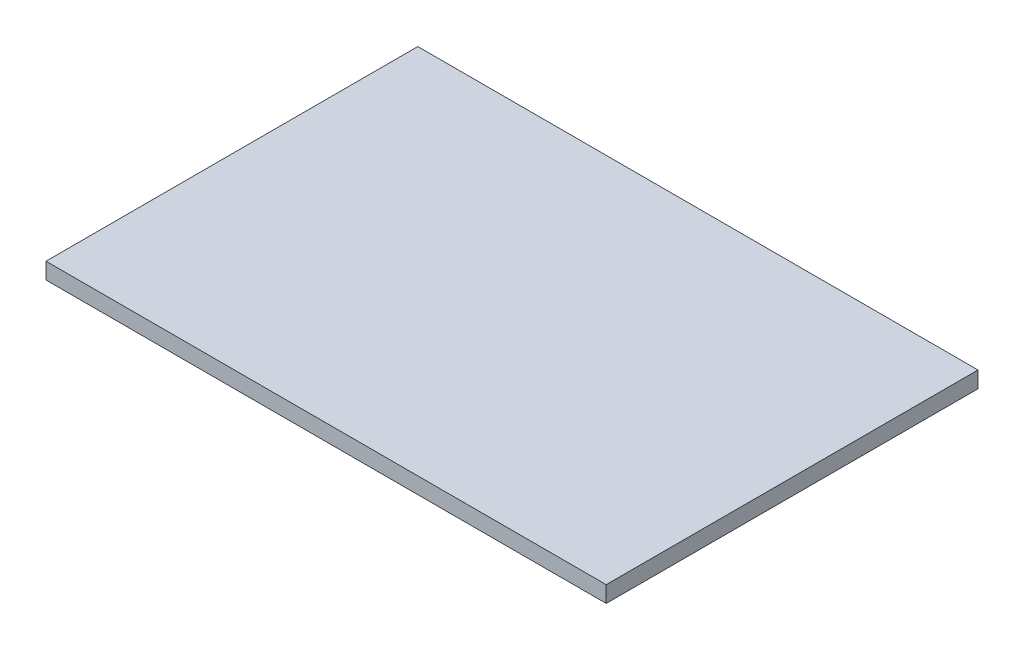
ISO-10303-21;
HEADER;
FILE_DESCRIPTION(('STEP AP214'),'2;1');
FILE_NAME('part.step','',(''),(''),'','','');
FILE_SCHEMA(('AUTOMOTIVE_DESIGN { 1 0 10303 214 1 1 1 1 }'));
ENDSEC;
DATA;
#1=APPLICATION_CONTEXT('core data for automotive mechanical design processes');
#2=APPLICATION_PROTOCOL_DEFINITION('international standard','automotive_design',2000,#1);
#3=PRODUCT_CONTEXT('',#1,'mechanical');
#4=PRODUCT('Part','Part','',(#3));
#5=PRODUCT_RELATED_PRODUCT_CATEGORY('part','',(#4));
#6=PRODUCT_DEFINITION_FORMATION('','',#4);
#7=PRODUCT_DEFINITION_CONTEXT('part definition',#1,'design');
#8=PRODUCT_DEFINITION('design','',#6,#7);
#9=PRODUCT_DEFINITION_SHAPE('','',#8);
#10=(LENGTH_UNIT() NAMED_UNIT(*) SI_UNIT(.MILLI.,.METRE.));
#11=(NAMED_UNIT(*) PLANE_ANGLE_UNIT() SI_UNIT($,.RADIAN.));
#12=(NAMED_UNIT(*) SI_UNIT($,.STERADIAN.) SOLID_ANGLE_UNIT());
#13=UNCERTAINTY_MEASURE_WITH_UNIT(LENGTH_MEASURE(1.E-05),#10,'distance_accuracy_value','');
#14=(GEOMETRIC_REPRESENTATION_CONTEXT(3) GLOBAL_UNCERTAINTY_ASSIGNED_CONTEXT((#13)) GLOBAL_UNIT_ASSIGNED_CONTEXT((#10,
#11,#12)) REPRESENTATION_CONTEXT('',''));
#15=CARTESIAN_POINT('',(0.,0.,0.));
#16=DIRECTION('',(0.,0.,1.));
#17=DIRECTION('',(1.,0.,0.));
#18=AXIS2_PLACEMENT_3D('',#15,#16,#17);
#19=CARTESIAN_POINT('',(275.,16.,182.5));
#20=DIRECTION('',(-1.,0.,0.));
#21=DIRECTION('',(0.,0.,1.));
#22=AXIS2_PLACEMENT_3D('',#19,#20,#21);
#23=PLANE('',#22);
#24=DIRECTION('',(0.,0.,-1.));
#25=VECTOR('',#24,1.);
#26=CARTESIAN_POINT('',(275.,0.,182.5));
#27=LINE('',#26,#25);
#28=CARTESIAN_POINT('',(275.,0.,182.5));
#29=VERTEX_POINT('',#28);
#30=CARTESIAN_POINT('',(275.,0.,-182.5));
#31=VERTEX_POINT('',#30);
#32=EDGE_CURVE('E96',#29,#31,#27,.T.);
#33=ORIENTED_EDGE('',*,*,#32,.T.);
#34=DIRECTION('',(0.,-1.,0.));
#35=VECTOR('',#34,1.);
#36=CARTESIAN_POINT('',(275.,16.,-182.5));
#37=LINE('',#36,#35);
#38=CARTESIAN_POINT('',(275.,16.,-182.5));
#39=VERTEX_POINT('',#38);
#40=EDGE_CURVE('E11',#39,#31,#37,.T.);
#41=ORIENTED_EDGE('',*,*,#40,.F.);
#42=DIRECTION('',(0.,0.,-1.));
#43=VECTOR('',#42,1.);
#44=CARTESIAN_POINT('',(275.,16.,182.5));
#45=LINE('',#44,#43);
#46=CARTESIAN_POINT('',(275.,16.,182.5));
#47=VERTEX_POINT('',#46);
#48=EDGE_CURVE('E84',#47,#39,#45,.T.);
#49=ORIENTED_EDGE('',*,*,#48,.F.);
#50=DIRECTION('',(0.,-1.,0.));
#51=VECTOR('',#50,1.);
#52=CARTESIAN_POINT('',(275.,16.,182.5));
#53=LINE('',#52,#51);
#54=EDGE_CURVE('E92',#47,#29,#53,.T.);
#55=ORIENTED_EDGE('',*,*,#54,.T.);
#56=EDGE_LOOP('',(#33,#41,#49,#55));
#57=FACE_BOUND('',#56,.T.);
#58=ADVANCED_FACE('F33',(#57),#23,.F.);
#59=CARTESIAN_POINT('',(-275.,16.,-182.5));
#60=DIRECTION('',(0.,0.,1.));
#61=DIRECTION('',(1.,0.,0.));
#62=AXIS2_PLACEMENT_3D('',#59,#60,#61);
#63=PLANE('',#62);
#64=DIRECTION('',(-1.,0.,0.));
#65=VECTOR('',#64,1.);
#66=CARTESIAN_POINT('',(-275.,0.,-182.5));
#67=LINE('',#66,#65);
#68=CARTESIAN_POINT('',(-275.,0.,-182.5));
#69=VERTEX_POINT('',#68);
#70=EDGE_CURVE('E88',#31,#69,#67,.T.);
#71=ORIENTED_EDGE('',*,*,#70,.T.);
#72=DIRECTION('',(0.,-1.,0.));
#73=VECTOR('',#72,1.);
#74=CARTESIAN_POINT('',(-275.,16.,-182.5));
#75=LINE('',#74,#73);
#76=CARTESIAN_POINT('',(-275.,16.,-182.5));
#77=VERTEX_POINT('',#76);
#78=EDGE_CURVE('E41',#77,#69,#75,.T.);
#79=ORIENTED_EDGE('',*,*,#78,.F.);
#80=DIRECTION('',(-1.,0.,0.));
#81=VECTOR('',#80,1.);
#82=CARTESIAN_POINT('',(-275.,16.,-182.5));
#83=LINE('',#82,#81);
#84=EDGE_CURVE('E79',#39,#77,#83,.T.);
#85=ORIENTED_EDGE('',*,*,#84,.F.);
#86=ORIENTED_EDGE('',*,*,#40,.T.);
#87=EDGE_LOOP('',(#71,#79,#85,#86));
#88=FACE_BOUND('',#87,.T.);
#89=ADVANCED_FACE('F87',(#88),#63,.F.);
#90=CARTESIAN_POINT('',(-275.,16.,182.5));
#91=DIRECTION('',(1.,0.,0.));
#92=DIRECTION('',(0.,0.,-1.));
#93=AXIS2_PLACEMENT_3D('',#90,#91,#92);
#94=PLANE('',#93);
#95=DIRECTION('',(0.,0.,1.));
#96=VECTOR('',#95,1.);
#97=CARTESIAN_POINT('',(-275.,0.,182.5));
#98=LINE('',#97,#96);
#99=CARTESIAN_POINT('',(-275.,0.,182.5));
#100=VERTEX_POINT('',#99);
#101=EDGE_CURVE('E66',#69,#100,#98,.T.);
#102=ORIENTED_EDGE('',*,*,#101,.T.);
#103=DIRECTION('',(0.,-1.,0.));
#104=VECTOR('',#103,1.);
#105=CARTESIAN_POINT('',(-275.,16.,182.5));
#106=LINE('',#105,#104);
#107=CARTESIAN_POINT('',(-275.,16.,182.5));
#108=VERTEX_POINT('',#107);
#109=EDGE_CURVE('E89',#108,#100,#106,.T.);
#110=ORIENTED_EDGE('',*,*,#109,.F.);
#111=DIRECTION('',(0.,0.,1.));
#112=VECTOR('',#111,1.);
#113=CARTESIAN_POINT('',(-275.,16.,182.5));
#114=LINE('',#113,#112);
#115=EDGE_CURVE('E82',#77,#108,#114,.T.);
#116=ORIENTED_EDGE('',*,*,#115,.F.);
#117=ORIENTED_EDGE('',*,*,#78,.T.);
#118=EDGE_LOOP('',(#102,#110,#116,#117));
#119=FACE_BOUND('',#118,.T.);
#120=ADVANCED_FACE('F90',(#119),#94,.F.);
#121=CARTESIAN_POINT('',(-275.,16.,182.5));
#122=DIRECTION('',(0.,0.,-1.));
#123=DIRECTION('',(-1.,0.,0.));
#124=AXIS2_PLACEMENT_3D('',#121,#122,#123);
#125=PLANE('',#124);
#126=DIRECTION('',(1.,0.,0.));
#127=VECTOR('',#126,1.);
#128=CARTESIAN_POINT('',(-275.,0.,182.5));
#129=LINE('',#128,#127);
#130=EDGE_CURVE('E72',#100,#29,#129,.T.);
#131=ORIENTED_EDGE('',*,*,#130,.T.);
#132=ORIENTED_EDGE('',*,*,#54,.F.);
#133=DIRECTION('',(1.,0.,0.));
#134=VECTOR('',#133,1.);
#135=CARTESIAN_POINT('',(-275.,16.,182.5));
#136=LINE('',#135,#134);
#137=EDGE_CURVE('E49',#108,#47,#136,.T.);
#138=ORIENTED_EDGE('',*,*,#137,.F.);
#139=ORIENTED_EDGE('',*,*,#109,.T.);
#140=EDGE_LOOP('',(#131,#132,#138,#139));
#141=FACE_BOUND('',#140,.T.);
#142=ADVANCED_FACE('F103',(#141),#125,.F.);
#143=CARTESIAN_POINT('',(0.,16.,0.));
#144=DIRECTION('',(0.,-1.,0.));
#145=DIRECTION('',(0.,0.,-1.));
#146=AXIS2_PLACEMENT_3D('',#143,#144,#145);
#147=PLANE('',#146);
#148=ORIENTED_EDGE('',*,*,#48,.T.);
#149=ORIENTED_EDGE('',*,*,#84,.T.);
#150=ORIENTED_EDGE('',*,*,#115,.T.);
#151=ORIENTED_EDGE('',*,*,#137,.T.);
#152=EDGE_LOOP('',(#148,#149,#150,#151));
#153=FACE_BOUND('',#152,.T.);
#154=ADVANCED_FACE('F80',(#153),#147,.F.);
#155=CARTESIAN_POINT('',(0.,0.,0.));
#156=DIRECTION('',(0.,-1.,0.));
#157=DIRECTION('',(0.,0.,-1.));
#158=AXIS2_PLACEMENT_3D('',#155,#156,#157);
#159=PLANE('',#158);
#160=ORIENTED_EDGE('',*,*,#32,.F.);
#161=ORIENTED_EDGE('',*,*,#130,.F.);
#162=ORIENTED_EDGE('',*,*,#101,.F.);
#163=ORIENTED_EDGE('',*,*,#70,.F.);
#164=EDGE_LOOP('',(#160,#161,#162,#163));
#165=FACE_BOUND('',#164,.T.);
#166=ADVANCED_FACE('F106',(#165),#159,.T.);
#167=CLOSED_SHELL('',(#58,#89,#120,#142,#154,#166));
#168=MANIFOLD_SOLID_BREP('B2',#167);
#169=ADVANCED_BREP_SHAPE_REPRESENTATION('',(#18,#168),#14);
#170=SHAPE_DEFINITION_REPRESENTATION(#9,#169);
ENDSEC;
END-ISO-10303-21;
